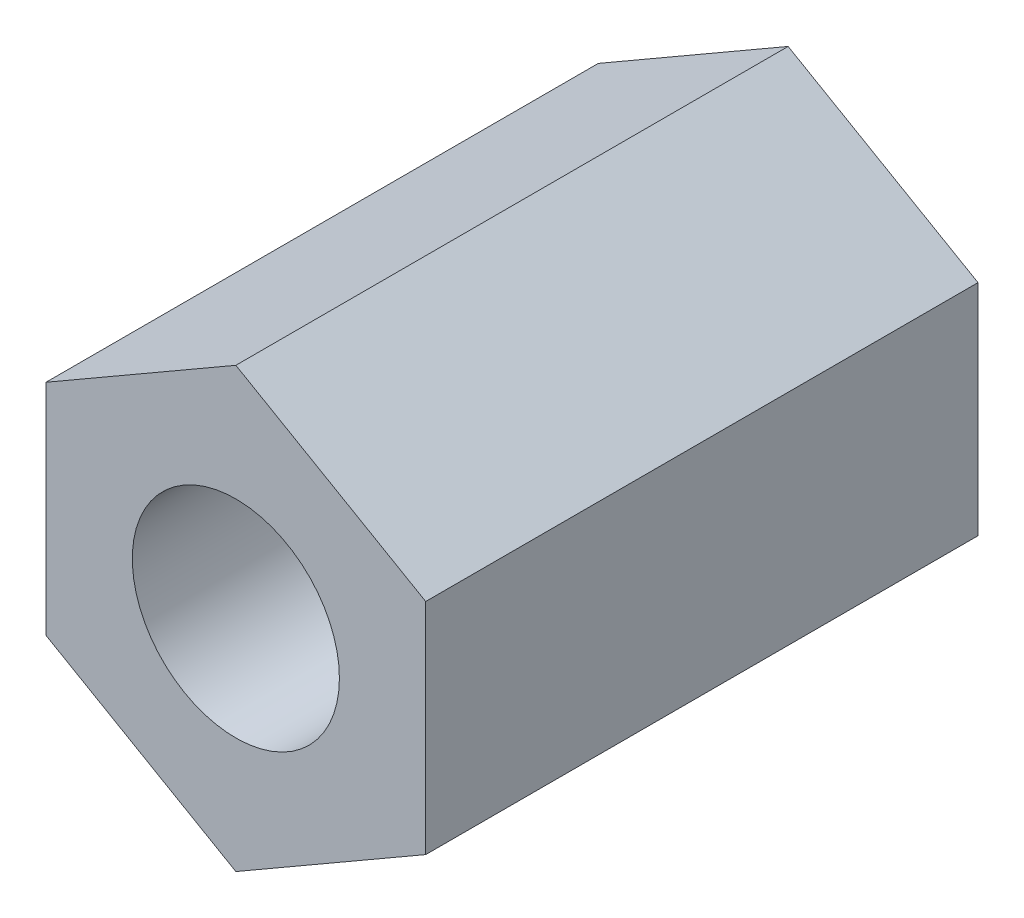
ISO-10303-21;
HEADER;
FILE_DESCRIPTION(('STEP AP214'),'2;1');
FILE_NAME('part.step','',(''),(''),'','','');
FILE_SCHEMA(('AUTOMOTIVE_DESIGN { 1 0 10303 214 1 1 1 1 }'));
ENDSEC;
DATA;
#1=APPLICATION_CONTEXT('core data for automotive mechanical design processes');
#2=APPLICATION_PROTOCOL_DEFINITION('international standard','automotive_design',2000,#1);
#3=PRODUCT_CONTEXT('',#1,'mechanical');
#4=PRODUCT('Part','Part','',(#3));
#5=PRODUCT_RELATED_PRODUCT_CATEGORY('part','',(#4));
#6=PRODUCT_DEFINITION_FORMATION('','',#4);
#7=PRODUCT_DEFINITION_CONTEXT('part definition',#1,'design');
#8=PRODUCT_DEFINITION('design','',#6,#7);
#9=PRODUCT_DEFINITION_SHAPE('','',#8);
#10=(LENGTH_UNIT() NAMED_UNIT(*) SI_UNIT(.MILLI.,.METRE.));
#11=(NAMED_UNIT(*) PLANE_ANGLE_UNIT() SI_UNIT($,.RADIAN.));
#12=(NAMED_UNIT(*) SI_UNIT($,.STERADIAN.) SOLID_ANGLE_UNIT());
#13=UNCERTAINTY_MEASURE_WITH_UNIT(LENGTH_MEASURE(1.E-05),#10,'distance_accuracy_value','');
#14=(GEOMETRIC_REPRESENTATION_CONTEXT(3) GLOBAL_UNCERTAINTY_ASSIGNED_CONTEXT((#13)) GLOBAL_UNIT_ASSIGNED_CONTEXT((#10,
#11,#12)) REPRESENTATION_CONTEXT('',''));
#15=CARTESIAN_POINT('',(0.,0.,0.));
#16=DIRECTION('',(0.,0.,1.));
#17=DIRECTION('',(1.,0.,0.));
#18=AXIS2_PLACEMENT_3D('',#15,#16,#17);
#19=CARTESIAN_POINT('',(0.,0.,8.));
#20=DIRECTION('',(0.,0.,1.));
#21=DIRECTION('',(1.,0.,0.));
#22=AXIS2_PLACEMENT_3D('',#19,#20,#21);
#23=PLANE('',#22);
#24=DIRECTION('',(0.866025403784439,-0.5,0.));
#25=VECTOR('',#24,1.);
#26=CARTESIAN_POINT('',(-2.75,-1.58771324027147,8.));
#27=LINE('',#26,#25);
#28=CARTESIAN_POINT('',(-2.75,-1.58771324027147,8.));
#29=VERTEX_POINT('',#28);
#30=CARTESIAN_POINT('',(0.,-3.17542648054294,8.));
#31=VERTEX_POINT('',#30);
#32=EDGE_CURVE('E146',#29,#31,#27,.T.);
#33=ORIENTED_EDGE('',*,*,#32,.T.);
#34=DIRECTION('',(0.866025403784438,0.5,0.));
#35=VECTOR('',#34,1.);
#36=CARTESIAN_POINT('',(0.,-3.17542648054294,8.));
#37=LINE('',#36,#35);
#38=CARTESIAN_POINT('',(2.75,-1.58771324027147,8.));
#39=VERTEX_POINT('',#38);
#40=EDGE_CURVE('E94',#31,#39,#37,.T.);
#41=ORIENTED_EDGE('',*,*,#40,.T.);
#42=DIRECTION('',(0.,1.,0.));
#43=VECTOR('',#42,1.);
#44=CARTESIAN_POINT('',(2.75,-1.58771324027147,8.));
#45=LINE('',#44,#43);
#46=CARTESIAN_POINT('',(2.75,1.58771324027147,8.));
#47=VERTEX_POINT('',#46);
#48=EDGE_CURVE('E107',#39,#47,#45,.T.);
#49=ORIENTED_EDGE('',*,*,#48,.T.);
#50=DIRECTION('',(-0.866025403784438,0.5,0.));
#51=VECTOR('',#50,1.);
#52=CARTESIAN_POINT('',(2.75,1.58771324027147,8.));
#53=LINE('',#52,#51);
#54=CARTESIAN_POINT('',(0.,3.17542648054294,8.));
#55=VERTEX_POINT('',#54);
#56=EDGE_CURVE('E101',#47,#55,#53,.T.);
#57=ORIENTED_EDGE('',*,*,#56,.T.);
#58=DIRECTION('',(-0.866025403784438,-0.5,0.));
#59=VECTOR('',#58,1.);
#60=CARTESIAN_POINT('',(0.,3.17542648054294,8.));
#61=LINE('',#60,#59);
#62=CARTESIAN_POINT('',(-2.75,1.58771324027147,8.));
#63=VERTEX_POINT('',#62);
#64=EDGE_CURVE('E105',#55,#63,#61,.T.);
#65=ORIENTED_EDGE('',*,*,#64,.T.);
#66=DIRECTION('',(0.,-1.,0.));
#67=VECTOR('',#66,1.);
#68=CARTESIAN_POINT('',(-2.75,1.58771324027147,8.));
#69=LINE('',#68,#67);
#70=EDGE_CURVE('E57',#63,#29,#69,.T.);
#71=ORIENTED_EDGE('',*,*,#70,.T.);
#72=EDGE_LOOP('',(#33,#41,#49,#57,#65,#71));
#73=FACE_BOUND('',#72,.T.);
#74=CARTESIAN_POINT('',(0.,0.,8.));
#75=DIRECTION('',(0.,0.,1.));
#76=DIRECTION('',(1.,0.,0.));
#77=AXIS2_PLACEMENT_3D('',#74,#75,#76);
#78=CIRCLE('',#77,1.5);
#79=CARTESIAN_POINT('',(1.5,0.,8.));
#80=VERTEX_POINT('',#79);
#81=EDGE_CURVE('E134',#80,#80,#78,.T.);
#82=ORIENTED_EDGE('',*,*,#81,.F.);
#83=EDGE_LOOP('',(#82));
#84=FACE_BOUND('',#83,.T.);
#85=ADVANCED_FACE('F39',(#73,#84),#23,.T.);
#86=CARTESIAN_POINT('',(0.,0.,0.));
#87=DIRECTION('',(0.,0.,1.));
#88=DIRECTION('',(1.,0.,0.));
#89=AXIS2_PLACEMENT_3D('',#86,#87,#88);
#90=PLANE('',#89);
#91=DIRECTION('',(0.866025403784439,-0.5,0.));
#92=VECTOR('',#91,1.);
#93=CARTESIAN_POINT('',(-2.75,-1.58771324027147,0.));
#94=LINE('',#93,#92);
#95=CARTESIAN_POINT('',(-2.75,-1.58771324027147,0.));
#96=VERTEX_POINT('',#95);
#97=CARTESIAN_POINT('',(0.,-3.17542648054294,0.));
#98=VERTEX_POINT('',#97);
#99=EDGE_CURVE('E129',#96,#98,#94,.T.);
#100=ORIENTED_EDGE('',*,*,#99,.F.);
#101=DIRECTION('',(0.,-1.,0.));
#102=VECTOR('',#101,1.);
#103=CARTESIAN_POINT('',(-2.75,1.58771324027147,0.));
#104=LINE('',#103,#102);
#105=CARTESIAN_POINT('',(-2.75,1.58771324027147,0.));
#106=VERTEX_POINT('',#105);
#107=EDGE_CURVE('E86',#106,#96,#104,.T.);
#108=ORIENTED_EDGE('',*,*,#107,.F.);
#109=DIRECTION('',(-0.866025403784438,-0.5,0.));
#110=VECTOR('',#109,1.);
#111=CARTESIAN_POINT('',(0.,3.17542648054294,0.));
#112=LINE('',#111,#110);
#113=CARTESIAN_POINT('',(0.,3.17542648054294,0.));
#114=VERTEX_POINT('',#113);
#115=EDGE_CURVE('E80',#114,#106,#112,.T.);
#116=ORIENTED_EDGE('',*,*,#115,.F.);
#117=DIRECTION('',(-0.866025403784438,0.5,0.));
#118=VECTOR('',#117,1.);
#119=CARTESIAN_POINT('',(2.75,1.58771324027147,0.));
#120=LINE('',#119,#118);
#121=CARTESIAN_POINT('',(2.75,1.58771324027147,0.));
#122=VERTEX_POINT('',#121);
#123=EDGE_CURVE('E116',#122,#114,#120,.T.);
#124=ORIENTED_EDGE('',*,*,#123,.F.);
#125=DIRECTION('',(0.,1.,0.));
#126=VECTOR('',#125,1.);
#127=CARTESIAN_POINT('',(2.75,-1.58771324027147,0.));
#128=LINE('',#127,#126);
#129=CARTESIAN_POINT('',(2.75,-1.58771324027147,0.));
#130=VERTEX_POINT('',#129);
#131=EDGE_CURVE('E137',#130,#122,#128,.T.);
#132=ORIENTED_EDGE('',*,*,#131,.F.);
#133=DIRECTION('',(0.866025403784438,0.5,0.));
#134=VECTOR('',#133,1.);
#135=CARTESIAN_POINT('',(0.,-3.17542648054294,0.));
#136=LINE('',#135,#134);
#137=EDGE_CURVE('E133',#98,#130,#136,.T.);
#138=ORIENTED_EDGE('',*,*,#137,.F.);
#139=EDGE_LOOP('',(#100,#108,#116,#124,#132,#138));
#140=FACE_BOUND('',#139,.T.);
#141=CARTESIAN_POINT('',(0.,0.,0.));
#142=DIRECTION('',(0.,0.,1.));
#143=DIRECTION('',(1.,0.,0.));
#144=AXIS2_PLACEMENT_3D('',#141,#142,#143);
#145=CIRCLE('',#144,1.5);
#146=CARTESIAN_POINT('',(1.5,0.,0.));
#147=VERTEX_POINT('',#146);
#148=EDGE_CURVE('E243',#147,#147,#145,.T.);
#149=ORIENTED_EDGE('',*,*,#148,.T.);
#150=EDGE_LOOP('',(#149));
#151=FACE_BOUND('',#150,.T.);
#152=ADVANCED_FACE('F159',(#140,#151),#90,.F.);
#153=CARTESIAN_POINT('',(-2.75,-1.58771324027147,8.));
#154=DIRECTION('',(0.5,0.866025403784439,0.));
#155=DIRECTION('',(-0.866025403784439,0.5,0.));
#156=AXIS2_PLACEMENT_3D('',#153,#154,#155);
#157=PLANE('',#156);
#158=ORIENTED_EDGE('',*,*,#99,.T.);
#159=DIRECTION('',(0.,0.,-1.));
#160=VECTOR('',#159,1.);
#161=CARTESIAN_POINT('',(0.,-3.17542648054294,8.));
#162=LINE('',#161,#160);
#163=EDGE_CURVE('E11',#31,#98,#162,.T.);
#164=ORIENTED_EDGE('',*,*,#163,.F.);
#165=ORIENTED_EDGE('',*,*,#32,.F.);
#166=DIRECTION('',(0.,0.,-1.));
#167=VECTOR('',#166,1.);
#168=CARTESIAN_POINT('',(-2.75,-1.58771324027147,8.));
#169=LINE('',#168,#167);
#170=EDGE_CURVE('E125',#29,#96,#169,.T.);
#171=ORIENTED_EDGE('',*,*,#170,.T.);
#172=EDGE_LOOP('',(#158,#164,#165,#171));
#173=FACE_BOUND('',#172,.T.);
#174=ADVANCED_FACE('F41',(#173),#157,.F.);
#175=CARTESIAN_POINT('',(0.,-3.17542648054294,8.));
#176=DIRECTION('',(-0.5,0.866025403784439,0.));
#177=DIRECTION('',(-0.866025403784438,-0.5,0.));
#178=AXIS2_PLACEMENT_3D('',#175,#176,#177);
#179=PLANE('',#178);
#180=ORIENTED_EDGE('',*,*,#137,.T.);
#181=DIRECTION('',(0.,0.,-1.));
#182=VECTOR('',#181,1.);
#183=CARTESIAN_POINT('',(2.75,-1.58771324027147,8.));
#184=LINE('',#183,#182);
#185=EDGE_CURVE('E49',#39,#130,#184,.T.);
#186=ORIENTED_EDGE('',*,*,#185,.F.);
#187=ORIENTED_EDGE('',*,*,#40,.F.);
#188=ORIENTED_EDGE('',*,*,#163,.T.);
#189=EDGE_LOOP('',(#180,#186,#187,#188));
#190=FACE_BOUND('',#189,.T.);
#191=ADVANCED_FACE('F184',(#190),#179,.F.);
#192=CARTESIAN_POINT('',(2.75,-1.58771324027147,8.));
#193=DIRECTION('',(-1.,0.,0.));
#194=DIRECTION('',(0.,0.,1.));
#195=AXIS2_PLACEMENT_3D('',#192,#193,#194);
#196=PLANE('',#195);
#197=ORIENTED_EDGE('',*,*,#131,.T.);
#198=DIRECTION('',(0.,0.,-1.));
#199=VECTOR('',#198,1.);
#200=CARTESIAN_POINT('',(2.75,1.58771324027147,8.));
#201=LINE('',#200,#199);
#202=EDGE_CURVE('E118',#47,#122,#201,.T.);
#203=ORIENTED_EDGE('',*,*,#202,.F.);
#204=ORIENTED_EDGE('',*,*,#48,.F.);
#205=ORIENTED_EDGE('',*,*,#185,.T.);
#206=EDGE_LOOP('',(#197,#203,#204,#205));
#207=FACE_BOUND('',#206,.T.);
#208=ADVANCED_FACE('F156',(#207),#196,.F.);
#209=CARTESIAN_POINT('',(2.75,1.58771324027147,8.));
#210=DIRECTION('',(-0.5,-0.866025403784439,0.));
#211=DIRECTION('',(0.866025403784439,-0.5,0.));
#212=AXIS2_PLACEMENT_3D('',#209,#210,#211);
#213=PLANE('',#212);
#214=ORIENTED_EDGE('',*,*,#123,.T.);
#215=DIRECTION('',(0.,0.,-1.));
#216=VECTOR('',#215,1.);
#217=CARTESIAN_POINT('',(0.,3.17542648054294,8.));
#218=LINE('',#217,#216);
#219=EDGE_CURVE('E113',#55,#114,#218,.T.);
#220=ORIENTED_EDGE('',*,*,#219,.F.);
#221=ORIENTED_EDGE('',*,*,#56,.F.);
#222=ORIENTED_EDGE('',*,*,#202,.T.);
#223=EDGE_LOOP('',(#214,#220,#221,#222));
#224=FACE_BOUND('',#223,.T.);
#225=ADVANCED_FACE('F114',(#224),#213,.F.);
#226=CARTESIAN_POINT('',(0.,3.17542648054294,8.));
#227=DIRECTION('',(0.5,-0.866025403784438,0.));
#228=DIRECTION('',(0.866025403784439,0.5,0.));
#229=AXIS2_PLACEMENT_3D('',#226,#227,#228);
#230=PLANE('',#229);
#231=ORIENTED_EDGE('',*,*,#115,.T.);
#232=DIRECTION('',(0.,0.,-1.));
#233=VECTOR('',#232,1.);
#234=CARTESIAN_POINT('',(-2.75,1.58771324027147,8.));
#235=LINE('',#234,#233);
#236=EDGE_CURVE('E119',#63,#106,#235,.T.);
#237=ORIENTED_EDGE('',*,*,#236,.F.);
#238=ORIENTED_EDGE('',*,*,#64,.F.);
#239=ORIENTED_EDGE('',*,*,#219,.T.);
#240=EDGE_LOOP('',(#231,#237,#238,#239));
#241=FACE_BOUND('',#240,.T.);
#242=ADVANCED_FACE('F121',(#241),#230,.F.);
#243=CARTESIAN_POINT('',(-2.75,1.58771324027147,8.));
#244=DIRECTION('',(1.,0.,0.));
#245=DIRECTION('',(0.,0.,-1.));
#246=AXIS2_PLACEMENT_3D('',#243,#244,#245);
#247=PLANE('',#246);
#248=ORIENTED_EDGE('',*,*,#107,.T.);
#249=ORIENTED_EDGE('',*,*,#170,.F.);
#250=ORIENTED_EDGE('',*,*,#70,.F.);
#251=ORIENTED_EDGE('',*,*,#236,.T.);
#252=EDGE_LOOP('',(#248,#249,#250,#251));
#253=FACE_BOUND('',#252,.T.);
#254=ADVANCED_FACE('F164',(#253),#247,.F.);
#255=CARTESIAN_POINT('',(0.,0.,8.));
#256=DIRECTION('',(0.,0.,-1.));
#257=DIRECTION('',(-1.,0.,0.));
#258=AXIS2_PLACEMENT_3D('',#255,#256,#257);
#259=CYLINDRICAL_SURFACE('',#258,1.5);
#260=ORIENTED_EDGE('',*,*,#81,.T.);
#261=EDGE_LOOP('',(#260));
#262=FACE_BOUND('',#261,.T.);
#263=ORIENTED_EDGE('',*,*,#148,.F.);
#264=EDGE_LOOP('',(#263));
#265=FACE_BOUND('',#264,.T.);
#266=ADVANCED_FACE('F166',(#262,#265),#259,.F.);
#267=CLOSED_SHELL('',(#85,#152,#174,#191,#208,#225,#242,#254,#266));
#268=MANIFOLD_SOLID_BREP('B2',#267);
#269=ADVANCED_BREP_SHAPE_REPRESENTATION('',(#18,#268),#14);
#270=SHAPE_DEFINITION_REPRESENTATION(#9,#269);
ENDSEC;
END-ISO-10303-21;
